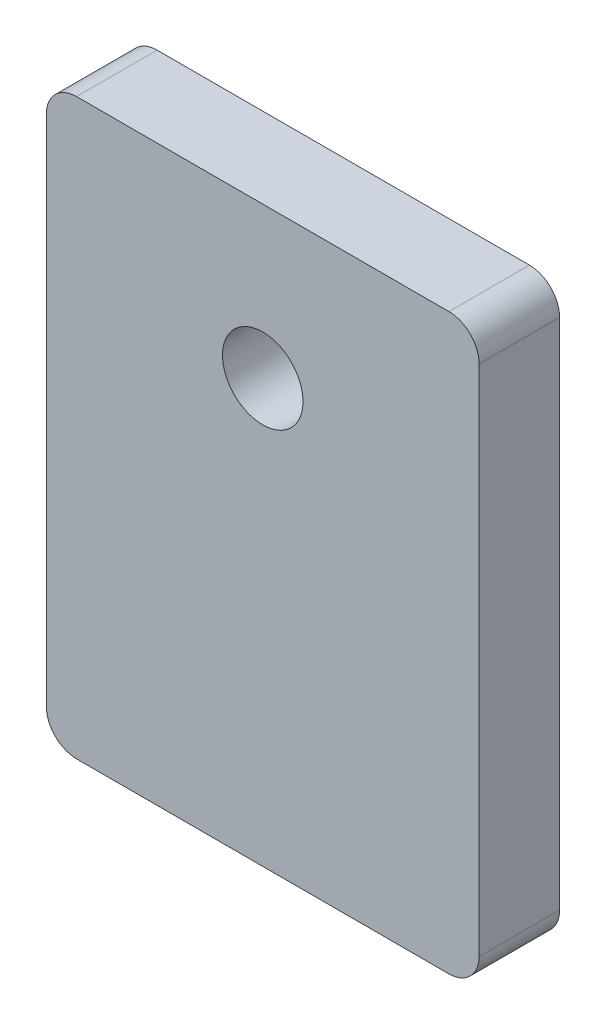
ISO-10303-21;
HEADER;
FILE_DESCRIPTION(('STEP AP214'),'2;1');
FILE_NAME('part.step','',(''),(''),'','','');
FILE_SCHEMA(('AUTOMOTIVE_DESIGN { 1 0 10303 214 1 1 1 1 }'));
ENDSEC;
DATA;
#1=APPLICATION_CONTEXT('core data for automotive mechanical design processes');
#2=APPLICATION_PROTOCOL_DEFINITION('international standard','automotive_design',2000,#1);
#3=PRODUCT_CONTEXT('',#1,'mechanical');
#4=PRODUCT('Part','Part','',(#3));
#5=PRODUCT_RELATED_PRODUCT_CATEGORY('part','',(#4));
#6=PRODUCT_DEFINITION_FORMATION('','',#4);
#7=PRODUCT_DEFINITION_CONTEXT('part definition',#1,'design');
#8=PRODUCT_DEFINITION('design','',#6,#7);
#9=PRODUCT_DEFINITION_SHAPE('','',#8);
#10=(LENGTH_UNIT() NAMED_UNIT(*) SI_UNIT(.MILLI.,.METRE.));
#11=(NAMED_UNIT(*) PLANE_ANGLE_UNIT() SI_UNIT($,.RADIAN.));
#12=(NAMED_UNIT(*) SI_UNIT($,.STERADIAN.) SOLID_ANGLE_UNIT());
#13=UNCERTAINTY_MEASURE_WITH_UNIT(LENGTH_MEASURE(1.E-05),#10,'distance_accuracy_value','');
#14=(GEOMETRIC_REPRESENTATION_CONTEXT(3) GLOBAL_UNCERTAINTY_ASSIGNED_CONTEXT((#13)) GLOBAL_UNIT_ASSIGNED_CONTEXT((#10,
#11,#12)) REPRESENTATION_CONTEXT('',''));
#15=CARTESIAN_POINT('',(0.,0.,0.));
#16=DIRECTION('',(0.,0.,1.));
#17=DIRECTION('',(1.,0.,0.));
#18=AXIS2_PLACEMENT_3D('',#15,#16,#17);
#19=CARTESIAN_POINT('',(21.5,-28.5,4.));
#20=DIRECTION('',(-1.,0.,0.));
#21=DIRECTION('',(0.,0.,1.));
#22=AXIS2_PLACEMENT_3D('',#19,#20,#21);
#23=PLANE('',#22);
#24=DIRECTION('',(0.,1.,0.));
#25=VECTOR('',#24,1.);
#26=CARTESIAN_POINT('',(21.5,-28.5,4.));
#27=LINE('',#26,#25);
#28=CARTESIAN_POINT('',(21.5,-25.5,4.));
#29=VERTEX_POINT('',#28);
#30=CARTESIAN_POINT('',(21.5,25.5,4.));
#31=VERTEX_POINT('',#30);
#32=EDGE_CURVE('E122',#29,#31,#27,.T.);
#33=ORIENTED_EDGE('',*,*,#32,.F.);
#34=DIRECTION('',(0.,0.,-1.));
#35=VECTOR('',#34,1.);
#36=CARTESIAN_POINT('',(21.5,-25.5,4.));
#37=LINE('',#36,#35);
#38=CARTESIAN_POINT('',(21.5,-25.5,-4.));
#39=VERTEX_POINT('',#38);
#40=EDGE_CURVE('E107',#29,#39,#37,.T.);
#41=ORIENTED_EDGE('',*,*,#40,.T.);
#42=DIRECTION('',(0.,1.,0.));
#43=VECTOR('',#42,1.);
#44=CARTESIAN_POINT('',(21.5,-28.5,-4.));
#45=LINE('',#44,#43);
#46=CARTESIAN_POINT('',(21.5,25.5,-4.));
#47=VERTEX_POINT('',#46);
#48=EDGE_CURVE('E119',#39,#47,#45,.T.);
#49=ORIENTED_EDGE('',*,*,#48,.T.);
#50=DIRECTION('',(0.,0.,-1.));
#51=VECTOR('',#50,1.);
#52=CARTESIAN_POINT('',(21.5,25.5,4.));
#53=LINE('',#52,#51);
#54=EDGE_CURVE('E124',#47,#31,#53,.F.);
#55=ORIENTED_EDGE('',*,*,#54,.T.);
#56=EDGE_LOOP('',(#33,#41,#49,#55));
#57=FACE_BOUND('',#56,.T.);
#58=ADVANCED_FACE('F37',(#57),#23,.F.);
#59=CARTESIAN_POINT('',(-21.5,28.5,4.));
#60=DIRECTION('',(0.,-1.,0.));
#61=DIRECTION('',(0.,0.,-1.));
#62=AXIS2_PLACEMENT_3D('',#59,#60,#61);
#63=PLANE('',#62);
#64=DIRECTION('',(-1.,0.,0.));
#65=VECTOR('',#64,1.);
#66=CARTESIAN_POINT('',(-21.5,28.5,-4.));
#67=LINE('',#66,#65);
#68=CARTESIAN_POINT('',(18.5,28.5,-4.));
#69=VERTEX_POINT('',#68);
#70=CARTESIAN_POINT('',(-18.5,28.5,-4.));
#71=VERTEX_POINT('',#70);
#72=EDGE_CURVE('E128',#69,#71,#67,.T.);
#73=ORIENTED_EDGE('',*,*,#72,.T.);
#74=DIRECTION('',(0.,0.,-1.));
#75=VECTOR('',#74,1.);
#76=CARTESIAN_POINT('',(-18.5,28.5,4.));
#77=LINE('',#76,#75);
#78=CARTESIAN_POINT('',(-18.5,28.5,4.));
#79=VERTEX_POINT('',#78);
#80=EDGE_CURVE('E11',#71,#79,#77,.F.);
#81=ORIENTED_EDGE('',*,*,#80,.T.);
#82=DIRECTION('',(-1.,0.,0.));
#83=VECTOR('',#82,1.);
#84=CARTESIAN_POINT('',(-21.5,28.5,4.));
#85=LINE('',#84,#83);
#86=CARTESIAN_POINT('',(18.5,28.5,4.));
#87=VERTEX_POINT('',#86);
#88=EDGE_CURVE('E168',#87,#79,#85,.T.);
#89=ORIENTED_EDGE('',*,*,#88,.F.);
#90=DIRECTION('',(0.,0.,-1.));
#91=VECTOR('',#90,1.);
#92=CARTESIAN_POINT('',(18.5,28.5,4.));
#93=LINE('',#92,#91);
#94=EDGE_CURVE('E45',#87,#69,#93,.T.);
#95=ORIENTED_EDGE('',*,*,#94,.T.);
#96=EDGE_LOOP('',(#73,#81,#89,#95));
#97=FACE_BOUND('',#96,.T.);
#98=ADVANCED_FACE('F166',(#97),#63,.F.);
#99=CARTESIAN_POINT('',(-21.5,-28.5,4.));
#100=DIRECTION('',(1.,0.,0.));
#101=DIRECTION('',(0.,0.,-1.));
#102=AXIS2_PLACEMENT_3D('',#99,#100,#101);
#103=PLANE('',#102);
#104=DIRECTION('',(0.,-1.,0.));
#105=VECTOR('',#104,1.);
#106=CARTESIAN_POINT('',(-21.5,-28.5,-4.));
#107=LINE('',#106,#105);
#108=CARTESIAN_POINT('',(-21.5,25.5,-4.));
#109=VERTEX_POINT('',#108);
#110=CARTESIAN_POINT('',(-21.5,-25.5,-4.));
#111=VERTEX_POINT('',#110);
#112=EDGE_CURVE('E132',#109,#111,#107,.T.);
#113=ORIENTED_EDGE('',*,*,#112,.T.);
#114=DIRECTION('',(0.,0.,-1.));
#115=VECTOR('',#114,1.);
#116=CARTESIAN_POINT('',(-21.5,-25.5,4.));
#117=LINE('',#116,#115);
#118=CARTESIAN_POINT('',(-21.5,-25.5,4.));
#119=VERTEX_POINT('',#118);
#120=EDGE_CURVE('E52',#111,#119,#117,.F.);
#121=ORIENTED_EDGE('',*,*,#120,.T.);
#122=DIRECTION('',(0.,-1.,0.));
#123=VECTOR('',#122,1.);
#124=CARTESIAN_POINT('',(-21.5,-28.5,4.));
#125=LINE('',#124,#123);
#126=CARTESIAN_POINT('',(-21.5,25.5,4.));
#127=VERTEX_POINT('',#126);
#128=EDGE_CURVE('E176',#127,#119,#125,.T.);
#129=ORIENTED_EDGE('',*,*,#128,.F.);
#130=DIRECTION('',(0.,0.,-1.));
#131=VECTOR('',#130,1.);
#132=CARTESIAN_POINT('',(-21.5,25.5,4.));
#133=LINE('',#132,#131);
#134=EDGE_CURVE('E159',#127,#109,#133,.T.);
#135=ORIENTED_EDGE('',*,*,#134,.T.);
#136=EDGE_LOOP('',(#113,#121,#129,#135));
#137=FACE_BOUND('',#136,.T.);
#138=ADVANCED_FACE('F175',(#137),#103,.F.);
#139=CARTESIAN_POINT('',(-21.5,-28.5,4.));
#140=DIRECTION('',(0.,1.,0.));
#141=DIRECTION('',(0.,0.,1.));
#142=AXIS2_PLACEMENT_3D('',#139,#140,#141);
#143=PLANE('',#142);
#144=DIRECTION('',(1.,0.,0.));
#145=VECTOR('',#144,1.);
#146=CARTESIAN_POINT('',(-21.5,-28.5,-4.));
#147=LINE('',#146,#145);
#148=CARTESIAN_POINT('',(-18.5,-28.5,-4.));
#149=VERTEX_POINT('',#148);
#150=CARTESIAN_POINT('',(18.5,-28.5,-4.));
#151=VERTEX_POINT('',#150);
#152=EDGE_CURVE('E142',#149,#151,#147,.T.);
#153=ORIENTED_EDGE('',*,*,#152,.T.);
#154=DIRECTION('',(0.,0.,-1.));
#155=VECTOR('',#154,1.);
#156=CARTESIAN_POINT('',(18.5,-28.5,4.));
#157=LINE('',#156,#155);
#158=CARTESIAN_POINT('',(18.5,-28.5,4.));
#159=VERTEX_POINT('',#158);
#160=EDGE_CURVE('E108',#151,#159,#157,.F.);
#161=ORIENTED_EDGE('',*,*,#160,.T.);
#162=DIRECTION('',(1.,0.,0.));
#163=VECTOR('',#162,1.);
#164=CARTESIAN_POINT('',(-21.5,-28.5,4.));
#165=LINE('',#164,#163);
#166=CARTESIAN_POINT('',(-18.5,-28.5,4.));
#167=VERTEX_POINT('',#166);
#168=EDGE_CURVE('E138',#167,#159,#165,.T.);
#169=ORIENTED_EDGE('',*,*,#168,.F.);
#170=DIRECTION('',(0.,0.,-1.));
#171=VECTOR('',#170,1.);
#172=CARTESIAN_POINT('',(-18.5,-28.5,4.));
#173=LINE('',#172,#171);
#174=EDGE_CURVE('E113',#167,#149,#173,.T.);
#175=ORIENTED_EDGE('',*,*,#174,.T.);
#176=EDGE_LOOP('',(#153,#161,#169,#175));
#177=FACE_BOUND('',#176,.T.);
#178=ADVANCED_FACE('F189',(#177),#143,.F.);
#179=CARTESIAN_POINT('',(0.,0.,4.));
#180=DIRECTION('',(0.,0.,-1.));
#181=DIRECTION('',(-1.,0.,0.));
#182=AXIS2_PLACEMENT_3D('',#179,#180,#181);
#183=PLANE('',#182);
#184=CARTESIAN_POINT('',(0.,13.5,4.));
#185=DIRECTION('',(0.,0.,1.));
#186=DIRECTION('',(1.,0.,0.));
#187=AXIS2_PLACEMENT_3D('',#184,#185,#186);
#188=CIRCLE('',#187,4.);
#189=CARTESIAN_POINT('',(4.,13.5,4.));
#190=VERTEX_POINT('',#189);
#191=EDGE_CURVE('E135',#190,#190,#188,.T.);
#192=ORIENTED_EDGE('',*,*,#191,.F.);
#193=EDGE_LOOP('',(#192));
#194=FACE_BOUND('',#193,.T.);
#195=ORIENTED_EDGE('',*,*,#168,.T.);
#196=CARTESIAN_POINT('',(18.5,-25.5,4.));
#197=DIRECTION('',(0.,0.,-1.));
#198=DIRECTION('',(-1.,0.,0.));
#199=AXIS2_PLACEMENT_3D('',#196,#197,#198);
#200=CIRCLE('',#199,3.);
#201=EDGE_CURVE('E157',#159,#29,#200,.F.);
#202=ORIENTED_EDGE('',*,*,#201,.T.);
#203=ORIENTED_EDGE('',*,*,#32,.T.);
#204=CARTESIAN_POINT('',(18.5,25.5,4.));
#205=DIRECTION('',(0.,0.,-1.));
#206=DIRECTION('',(-1.,0.,0.));
#207=AXIS2_PLACEMENT_3D('',#204,#205,#206);
#208=CIRCLE('',#207,3.);
#209=EDGE_CURVE('E152',#31,#87,#208,.F.);
#210=ORIENTED_EDGE('',*,*,#209,.T.);
#211=ORIENTED_EDGE('',*,*,#88,.T.);
#212=CARTESIAN_POINT('',(-18.5,25.5,4.));
#213=DIRECTION('',(0.,0.,-1.));
#214=DIRECTION('',(-1.,0.,0.));
#215=AXIS2_PLACEMENT_3D('',#212,#213,#214);
#216=CIRCLE('',#215,3.);
#217=EDGE_CURVE('E59',#79,#127,#216,.F.);
#218=ORIENTED_EDGE('',*,*,#217,.T.);
#219=ORIENTED_EDGE('',*,*,#128,.T.);
#220=CARTESIAN_POINT('',(-18.5,-25.5,4.));
#221=DIRECTION('',(0.,0.,-1.));
#222=DIRECTION('',(-1.,0.,0.));
#223=AXIS2_PLACEMENT_3D('',#220,#221,#222);
#224=CIRCLE('',#223,3.);
#225=EDGE_CURVE('E155',#119,#167,#224,.F.);
#226=ORIENTED_EDGE('',*,*,#225,.T.);
#227=EDGE_LOOP('',(#195,#202,#203,#210,#211,#218,#219,#226));
#228=FACE_BOUND('',#227,.T.);
#229=ADVANCED_FACE('F187',(#194,#228),#183,.F.);
#230=CARTESIAN_POINT('',(0.,0.,-4.));
#231=DIRECTION('',(0.,0.,-1.));
#232=DIRECTION('',(-1.,0.,0.));
#233=AXIS2_PLACEMENT_3D('',#230,#231,#232);
#234=PLANE('',#233);
#235=CARTESIAN_POINT('',(0.,13.5,-4.));
#236=DIRECTION('',(0.,0.,1.));
#237=DIRECTION('',(1.,0.,0.));
#238=AXIS2_PLACEMENT_3D('',#235,#236,#237);
#239=CIRCLE('',#238,4.);
#240=CARTESIAN_POINT('',(4.,13.5,-4.));
#241=VERTEX_POINT('',#240);
#242=EDGE_CURVE('E129',#241,#241,#239,.T.);
#243=ORIENTED_EDGE('',*,*,#242,.T.);
#244=EDGE_LOOP('',(#243));
#245=FACE_BOUND('',#244,.T.);
#246=ORIENTED_EDGE('',*,*,#48,.F.);
#247=CARTESIAN_POINT('',(18.5,-25.5,-4.));
#248=DIRECTION('',(0.,0.,-1.));
#249=DIRECTION('',(-1.,0.,0.));
#250=AXIS2_PLACEMENT_3D('',#247,#248,#249);
#251=CIRCLE('',#250,3.);
#252=EDGE_CURVE('E103',#39,#151,#251,.T.);
#253=ORIENTED_EDGE('',*,*,#252,.T.);
#254=ORIENTED_EDGE('',*,*,#152,.F.);
#255=CARTESIAN_POINT('',(-18.5,-25.5,-4.));
#256=DIRECTION('',(0.,0.,-1.));
#257=DIRECTION('',(-1.,0.,0.));
#258=AXIS2_PLACEMENT_3D('',#255,#256,#257);
#259=CIRCLE('',#258,3.);
#260=EDGE_CURVE('E114',#149,#111,#259,.T.);
#261=ORIENTED_EDGE('',*,*,#260,.T.);
#262=ORIENTED_EDGE('',*,*,#112,.F.);
#263=CARTESIAN_POINT('',(-18.5,25.5,-4.));
#264=DIRECTION('',(0.,0.,-1.));
#265=DIRECTION('',(-1.,0.,0.));
#266=AXIS2_PLACEMENT_3D('',#263,#264,#265);
#267=CIRCLE('',#266,3.);
#268=EDGE_CURVE('E146',#109,#71,#267,.T.);
#269=ORIENTED_EDGE('',*,*,#268,.T.);
#270=ORIENTED_EDGE('',*,*,#72,.F.);
#271=CARTESIAN_POINT('',(18.5,25.5,-4.));
#272=DIRECTION('',(0.,0.,-1.));
#273=DIRECTION('',(-1.,0.,0.));
#274=AXIS2_PLACEMENT_3D('',#271,#272,#273);
#275=CIRCLE('',#274,3.);
#276=EDGE_CURVE('E123',#69,#47,#275,.T.);
#277=ORIENTED_EDGE('',*,*,#276,.T.);
#278=EDGE_LOOP('',(#246,#253,#254,#261,#262,#269,#270,#277));
#279=FACE_BOUND('',#278,.T.);
#280=ADVANCED_FACE('F126',(#245,#279),#234,.T.);
#281=CARTESIAN_POINT('',(0.,13.5,-4.));
#282=DIRECTION('',(0.,0.,1.));
#283=DIRECTION('',(1.,0.,0.));
#284=AXIS2_PLACEMENT_3D('',#281,#282,#283);
#285=CYLINDRICAL_SURFACE('',#284,4.);
#286=ORIENTED_EDGE('',*,*,#242,.F.);
#287=EDGE_LOOP('',(#286));
#288=FACE_BOUND('',#287,.T.);
#289=ORIENTED_EDGE('',*,*,#191,.T.);
#290=EDGE_LOOP('',(#289));
#291=FACE_BOUND('',#290,.T.);
#292=ADVANCED_FACE('F185',(#288,#291),#285,.F.);
#293=CARTESIAN_POINT('',(18.5,-25.5,4.));
#294=DIRECTION('',(0.,0.,-1.));
#295=DIRECTION('',(-1.,0.,0.));
#296=AXIS2_PLACEMENT_3D('',#293,#294,#295);
#297=CYLINDRICAL_SURFACE('',#296,3.);
#298=ORIENTED_EDGE('',*,*,#201,.F.);
#299=ORIENTED_EDGE('',*,*,#160,.F.);
#300=ORIENTED_EDGE('',*,*,#252,.F.);
#301=ORIENTED_EDGE('',*,*,#40,.F.);
#302=EDGE_LOOP('',(#298,#299,#300,#301));
#303=FACE_BOUND('',#302,.T.);
#304=ADVANCED_FACE('F106',(#303),#297,.T.);
#305=CARTESIAN_POINT('',(-18.5,-25.5,4.));
#306=DIRECTION('',(0.,0.,-1.));
#307=DIRECTION('',(-1.,0.,0.));
#308=AXIS2_PLACEMENT_3D('',#305,#306,#307);
#309=CYLINDRICAL_SURFACE('',#308,3.);
#310=ORIENTED_EDGE('',*,*,#225,.F.);
#311=ORIENTED_EDGE('',*,*,#120,.F.);
#312=ORIENTED_EDGE('',*,*,#260,.F.);
#313=ORIENTED_EDGE('',*,*,#174,.F.);
#314=EDGE_LOOP('',(#310,#311,#312,#313));
#315=FACE_BOUND('',#314,.T.);
#316=ADVANCED_FACE('F195',(#315),#309,.T.);
#317=CARTESIAN_POINT('',(-18.5,25.5,4.));
#318=DIRECTION('',(0.,0.,-1.));
#319=DIRECTION('',(-1.,0.,0.));
#320=AXIS2_PLACEMENT_3D('',#317,#318,#319);
#321=CYLINDRICAL_SURFACE('',#320,3.);
#322=ORIENTED_EDGE('',*,*,#217,.F.);
#323=ORIENTED_EDGE('',*,*,#80,.F.);
#324=ORIENTED_EDGE('',*,*,#268,.F.);
#325=ORIENTED_EDGE('',*,*,#134,.F.);
#326=EDGE_LOOP('',(#322,#323,#324,#325));
#327=FACE_BOUND('',#326,.T.);
#328=ADVANCED_FACE('F174',(#327),#321,.T.);
#329=CARTESIAN_POINT('',(18.5,25.5,4.));
#330=DIRECTION('',(0.,0.,-1.));
#331=DIRECTION('',(-1.,0.,0.));
#332=AXIS2_PLACEMENT_3D('',#329,#330,#331);
#333=CYLINDRICAL_SURFACE('',#332,3.);
#334=ORIENTED_EDGE('',*,*,#209,.F.);
#335=ORIENTED_EDGE('',*,*,#54,.F.);
#336=ORIENTED_EDGE('',*,*,#276,.F.);
#337=ORIENTED_EDGE('',*,*,#94,.F.);
#338=EDGE_LOOP('',(#334,#335,#336,#337));
#339=FACE_BOUND('',#338,.T.);
#340=ADVANCED_FACE('F39',(#339),#333,.T.);
#341=CLOSED_SHELL('',(#58,#98,#138,#178,#229,#280,#292,#304,#316,#328,#340));
#342=MANIFOLD_SOLID_BREP('B2',#341);
#343=ADVANCED_BREP_SHAPE_REPRESENTATION('',(#18,#342),#14);
#344=SHAPE_DEFINITION_REPRESENTATION(#9,#343);
ENDSEC;
END-ISO-10303-21;
